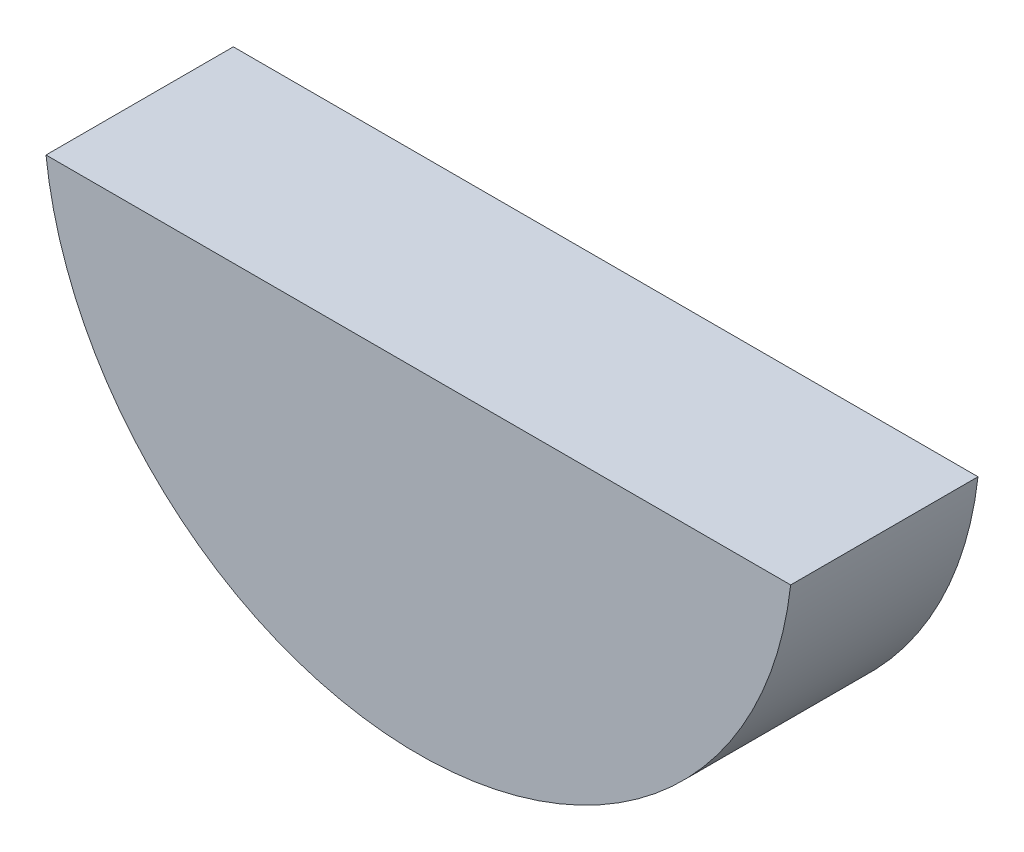
ISO-10303-21;
HEADER;
FILE_DESCRIPTION(('STEP AP214'),'2;1');
FILE_NAME('part.step','',(''),(''),'','','');
FILE_SCHEMA(('AUTOMOTIVE_DESIGN { 1 0 10303 214 1 1 1 1 }'));
ENDSEC;
DATA;
#1=APPLICATION_CONTEXT('core data for automotive mechanical design processes');
#2=APPLICATION_PROTOCOL_DEFINITION('international standard','automotive_design',2000,#1);
#3=PRODUCT_CONTEXT('',#1,'mechanical');
#4=PRODUCT('Part','Part','',(#3));
#5=PRODUCT_RELATED_PRODUCT_CATEGORY('part','',(#4));
#6=PRODUCT_DEFINITION_FORMATION('','',#4);
#7=PRODUCT_DEFINITION_CONTEXT('part definition',#1,'design');
#8=PRODUCT_DEFINITION('design','',#6,#7);
#9=PRODUCT_DEFINITION_SHAPE('','',#8);
#10=(LENGTH_UNIT() NAMED_UNIT(*) SI_UNIT(.MILLI.,.METRE.));
#11=(NAMED_UNIT(*) PLANE_ANGLE_UNIT() SI_UNIT($,.RADIAN.));
#12=(NAMED_UNIT(*) SI_UNIT($,.STERADIAN.) SOLID_ANGLE_UNIT());
#13=UNCERTAINTY_MEASURE_WITH_UNIT(LENGTH_MEASURE(1.E-05),#10,'distance_accuracy_value','');
#14=(GEOMETRIC_REPRESENTATION_CONTEXT(3) GLOBAL_UNCERTAINTY_ASSIGNED_CONTEXT((#13)) GLOBAL_UNIT_ASSIGNED_CONTEXT((#10,
#11,#12)) REPRESENTATION_CONTEXT('',''));
#15=CARTESIAN_POINT('',(0.,0.,0.));
#16=DIRECTION('',(0.,0.,1.));
#17=DIRECTION('',(1.,0.,0.));
#18=AXIS2_PLACEMENT_3D('',#15,#16,#17);
#19=CARTESIAN_POINT('',(0.,0.,1.5875));
#20=DIRECTION('',(0.,0.,-1.));
#21=DIRECTION('',(-1.,0.,0.));
#22=AXIS2_PLACEMENT_3D('',#19,#20,#21);
#23=CYLINDRICAL_SURFACE('',#22,3.175);
#24=CARTESIAN_POINT('',(0.,0.,1.5875));
#25=DIRECTION('',(0.,0.,1.));
#26=DIRECTION('',(1.,0.,0.));
#27=AXIS2_PLACEMENT_3D('',#24,#25,#26);
#28=CIRCLE('',#27,3.175);
#29=CARTESIAN_POINT('',(-3.15507019716389,-0.355185938584634,1.5875));
#30=VERTEX_POINT('',#29);
#31=CARTESIAN_POINT('',(3.15507019716389,-0.355185938584634,1.5875));
#32=VERTEX_POINT('',#31);
#33=EDGE_CURVE('E11',#30,#32,#28,.T.);
#34=ORIENTED_EDGE('',*,*,#33,.F.);
#35=DIRECTION('',(0.,0.,1.));
#36=VECTOR('',#35,1.);
#37=CARTESIAN_POINT('',(-3.15507019716389,-0.355185938584634,0.));
#38=LINE('',#37,#36);
#39=CARTESIAN_POINT('',(-3.15507019716389,-0.355185938584634,0.));
#40=VERTEX_POINT('',#39);
#41=EDGE_CURVE('E56',#40,#30,#38,.T.);
#42=ORIENTED_EDGE('',*,*,#41,.F.);
#43=CARTESIAN_POINT('',(0.,0.,0.));
#44=DIRECTION('',(0.,0.,1.));
#45=DIRECTION('',(1.,0.,0.));
#46=AXIS2_PLACEMENT_3D('',#43,#44,#45);
#47=CIRCLE('',#46,3.175);
#48=CARTESIAN_POINT('',(3.15507019716389,-0.355185938584634,0.));
#49=VERTEX_POINT('',#48);
#50=EDGE_CURVE('E36',#40,#49,#47,.T.);
#51=ORIENTED_EDGE('',*,*,#50,.T.);
#52=DIRECTION('',(0.,0.,1.));
#53=VECTOR('',#52,1.);
#54=CARTESIAN_POINT('',(3.15507019716389,-0.355185938584634,0.));
#55=LINE('',#54,#53);
#56=EDGE_CURVE('E47',#49,#32,#55,.T.);
#57=ORIENTED_EDGE('',*,*,#56,.T.);
#58=EDGE_LOOP('',(#34,#42,#51,#57));
#59=FACE_BOUND('',#58,.T.);
#60=ADVANCED_FACE('F33',(#59),#23,.T.);
#61=CARTESIAN_POINT('',(0.,0.,1.5875));
#62=DIRECTION('',(0.,0.,1.));
#63=DIRECTION('',(1.,0.,0.));
#64=AXIS2_PLACEMENT_3D('',#61,#62,#63);
#65=PLANE('',#64);
#66=DIRECTION('',(1.,0.,0.));
#67=VECTOR('',#66,1.);
#68=CARTESIAN_POINT('',(-3.15507019716389,-0.355185938584634,1.5875));
#69=LINE('',#68,#67);
#70=EDGE_CURVE('E59',#30,#32,#69,.T.);
#71=ORIENTED_EDGE('',*,*,#70,.F.);
#72=ORIENTED_EDGE('',*,*,#33,.T.);
#73=EDGE_LOOP('',(#71,#72));
#74=FACE_BOUND('',#73,.T.);
#75=ADVANCED_FACE('F66',(#74),#65,.T.);
#76=CARTESIAN_POINT('',(0.,0.,0.));
#77=DIRECTION('',(0.,0.,1.));
#78=DIRECTION('',(1.,0.,0.));
#79=AXIS2_PLACEMENT_3D('',#76,#77,#78);
#80=PLANE('',#79);
#81=ORIENTED_EDGE('',*,*,#50,.F.);
#82=DIRECTION('',(1.,0.,0.));
#83=VECTOR('',#82,1.);
#84=CARTESIAN_POINT('',(-3.15507019716389,-0.355185938584634,0.));
#85=LINE('',#84,#83);
#86=EDGE_CURVE('E52',#40,#49,#85,.T.);
#87=ORIENTED_EDGE('',*,*,#86,.T.);
#88=EDGE_LOOP('',(#81,#87));
#89=FACE_BOUND('',#88,.T.);
#90=ADVANCED_FACE('F71',(#89),#80,.F.);
#91=CARTESIAN_POINT('',(-3.15507019716389,-0.355185938584634,0.));
#92=DIRECTION('',(0.,-1.,0.));
#93=DIRECTION('',(0.,0.,-1.));
#94=AXIS2_PLACEMENT_3D('',#91,#92,#93);
#95=PLANE('',#94);
#96=ORIENTED_EDGE('',*,*,#70,.T.);
#97=ORIENTED_EDGE('',*,*,#56,.F.);
#98=ORIENTED_EDGE('',*,*,#86,.F.);
#99=ORIENTED_EDGE('',*,*,#41,.T.);
#100=EDGE_LOOP('',(#96,#97,#98,#99));
#101=FACE_BOUND('',#100,.T.);
#102=ADVANCED_FACE('F58',(#101),#95,.F.);
#103=CLOSED_SHELL('',(#60,#75,#90,#102));
#104=MANIFOLD_SOLID_BREP('B2',#103);
#105=ADVANCED_BREP_SHAPE_REPRESENTATION('',(#18,#104),#14);
#106=SHAPE_DEFINITION_REPRESENTATION(#9,#105);
ENDSEC;
END-ISO-10303-21;
